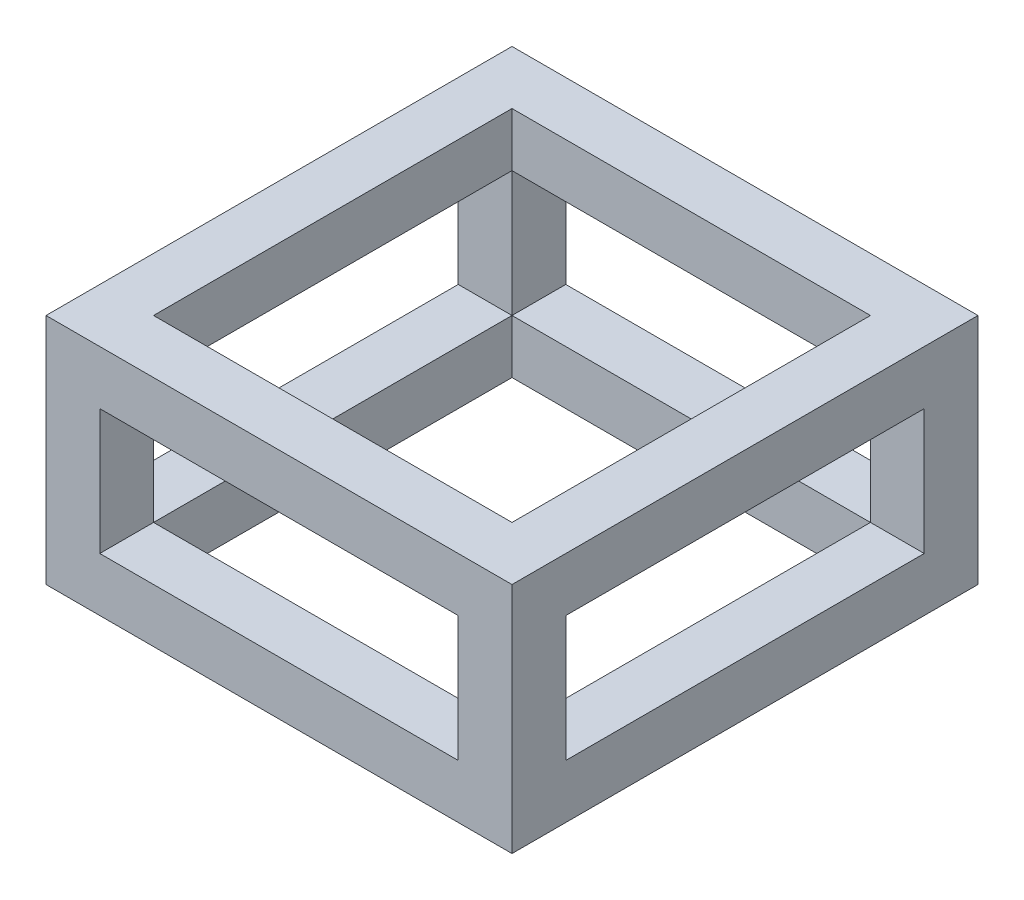
ISO-10303-21;
HEADER;
FILE_DESCRIPTION(('STEP AP214'),'2;1');
FILE_NAME('part.step','',(''),(''),'','','');
FILE_SCHEMA(('AUTOMOTIVE_DESIGN { 1 0 10303 214 1 1 1 1 }'));
ENDSEC;
DATA;
#1=APPLICATION_CONTEXT('core data for automotive mechanical design processes');
#2=APPLICATION_PROTOCOL_DEFINITION('international standard','automotive_design',2000,#1);
#3=PRODUCT_CONTEXT('',#1,'mechanical');
#4=PRODUCT('Part','Part','',(#3));
#5=PRODUCT_RELATED_PRODUCT_CATEGORY('part','',(#4));
#6=PRODUCT_DEFINITION_FORMATION('','',#4);
#7=PRODUCT_DEFINITION_CONTEXT('part definition',#1,'design');
#8=PRODUCT_DEFINITION('design','',#6,#7);
#9=PRODUCT_DEFINITION_SHAPE('','',#8);
#10=(LENGTH_UNIT() NAMED_UNIT(*) SI_UNIT(.MILLI.,.METRE.));
#11=(NAMED_UNIT(*) PLANE_ANGLE_UNIT() SI_UNIT($,.RADIAN.));
#12=(NAMED_UNIT(*) SI_UNIT($,.STERADIAN.) SOLID_ANGLE_UNIT());
#13=UNCERTAINTY_MEASURE_WITH_UNIT(LENGTH_MEASURE(1.E-05),#10,'distance_accuracy_value','');
#14=(GEOMETRIC_REPRESENTATION_CONTEXT(3) GLOBAL_UNCERTAINTY_ASSIGNED_CONTEXT((#13)) GLOBAL_UNIT_ASSIGNED_CONTEXT((#10,
#11,#12)) REPRESENTATION_CONTEXT('',''));
#15=CARTESIAN_POINT('',(0.,0.,0.));
#16=DIRECTION('',(0.,0.,1.));
#17=DIRECTION('',(1.,0.,0.));
#18=AXIS2_PLACEMENT_3D('',#15,#16,#17);
#19=CARTESIAN_POINT('',(0.,15.,0.));
#20=DIRECTION('',(0.,1.,0.));
#21=DIRECTION('',(0.,0.,1.));
#22=AXIS2_PLACEMENT_3D('',#19,#20,#21);
#23=PLANE('',#22);
#24=DIRECTION('',(1.,0.,0.));
#25=VECTOR('',#24,1.);
#26=CARTESIAN_POINT('',(-50.,15.,50.));
#27=LINE('',#26,#25);
#28=CARTESIAN_POINT('',(-50.,15.,50.));
#29=VERTEX_POINT('',#28);
#30=CARTESIAN_POINT('',(50.,15.,50.));
#31=VERTEX_POINT('',#30);
#32=EDGE_CURVE('E333',#29,#31,#27,.T.);
#33=ORIENTED_EDGE('',*,*,#32,.F.);
#34=DIRECTION('',(0.,0.,-1.));
#35=VECTOR('',#34,1.);
#36=CARTESIAN_POINT('',(-50.,15.,50.));
#37=LINE('',#36,#35);
#38=CARTESIAN_POINT('',(-50.,15.,65.));
#39=VERTEX_POINT('',#38);
#40=EDGE_CURVE('E231',#39,#29,#37,.T.);
#41=ORIENTED_EDGE('',*,*,#40,.F.);
#42=DIRECTION('',(1.,0.,0.));
#43=VECTOR('',#42,1.);
#44=CARTESIAN_POINT('',(-65.,15.,65.));
#45=LINE('',#44,#43);
#46=CARTESIAN_POINT('',(50.,15.,65.));
#47=VERTEX_POINT('',#46);
#48=EDGE_CURVE('E363',#39,#47,#45,.T.);
#49=ORIENTED_EDGE('',*,*,#48,.T.);
#50=DIRECTION('',(0.,0.,1.));
#51=VECTOR('',#50,1.);
#52=CARTESIAN_POINT('',(50.,15.,65.));
#53=LINE('',#52,#51);
#54=EDGE_CURVE('E265',#31,#47,#53,.T.);
#55=ORIENTED_EDGE('',*,*,#54,.F.);
#56=EDGE_LOOP('',(#33,#41,#49,#55));
#57=FACE_BOUND('',#56,.T.);
#58=ADVANCED_FACE('F33',(#57),#23,.T.);
#59=DIRECTION('',(0.,0.,1.));
#60=VECTOR('',#59,1.);
#61=CARTESIAN_POINT('',(-65.,15.,-65.));
#62=LINE('',#61,#60);
#63=CARTESIAN_POINT('',(-65.,15.,-50.));
#64=VERTEX_POINT('',#63);
#65=CARTESIAN_POINT('',(-65.,15.,50.));
#66=VERTEX_POINT('',#65);
#67=EDGE_CURVE('E48',#64,#66,#62,.T.);
#68=ORIENTED_EDGE('',*,*,#67,.T.);
#69=DIRECTION('',(-1.,0.,0.));
#70=VECTOR('',#69,1.);
#71=CARTESIAN_POINT('',(-50.,15.,50.));
#72=LINE('',#71,#70);
#73=EDGE_CURVE('E246',#29,#66,#72,.T.);
#74=ORIENTED_EDGE('',*,*,#73,.F.);
#75=DIRECTION('',(0.,0.,1.));
#76=VECTOR('',#75,1.);
#77=CARTESIAN_POINT('',(-50.,15.,-50.));
#78=LINE('',#77,#76);
#79=CARTESIAN_POINT('',(-50.,15.,-50.));
#80=VERTEX_POINT('',#79);
#81=EDGE_CURVE('E330',#80,#29,#78,.T.);
#82=ORIENTED_EDGE('',*,*,#81,.F.);
#83=DIRECTION('',(1.,0.,0.));
#84=VECTOR('',#83,1.);
#85=CARTESIAN_POINT('',(-65.,15.,-50.));
#86=LINE('',#85,#84);
#87=EDGE_CURVE('E301',#64,#80,#86,.T.);
#88=ORIENTED_EDGE('',*,*,#87,.F.);
#89=EDGE_LOOP('',(#68,#74,#82,#88));
#90=FACE_BOUND('',#89,.T.);
#91=ADVANCED_FACE('F437',(#90),#23,.T.);
#92=DIRECTION('',(0.,0.,-1.));
#93=VECTOR('',#92,1.);
#94=CARTESIAN_POINT('',(50.,15.,-50.));
#95=LINE('',#94,#93);
#96=CARTESIAN_POINT('',(50.,15.,-50.));
#97=VERTEX_POINT('',#96);
#98=EDGE_CURVE('E323',#31,#97,#95,.T.);
#99=ORIENTED_EDGE('',*,*,#98,.F.);
#100=DIRECTION('',(-1.,0.,0.));
#101=VECTOR('',#100,1.);
#102=CARTESIAN_POINT('',(65.,15.,50.));
#103=LINE('',#102,#101);
#104=CARTESIAN_POINT('',(65.,15.,50.));
#105=VERTEX_POINT('',#104);
#106=EDGE_CURVE('E56',#105,#31,#103,.T.);
#107=ORIENTED_EDGE('',*,*,#106,.F.);
#108=DIRECTION('',(0.,0.,-1.));
#109=VECTOR('',#108,1.);
#110=CARTESIAN_POINT('',(65.,15.,-65.));
#111=LINE('',#110,#109);
#112=CARTESIAN_POINT('',(65.,15.,-50.));
#113=VERTEX_POINT('',#112);
#114=EDGE_CURVE('E357',#105,#113,#111,.T.);
#115=ORIENTED_EDGE('',*,*,#114,.T.);
#116=DIRECTION('',(1.,0.,0.));
#117=VECTOR('',#116,1.);
#118=CARTESIAN_POINT('',(50.,15.,-50.));
#119=LINE('',#118,#117);
#120=EDGE_CURVE('E285',#97,#113,#119,.T.);
#121=ORIENTED_EDGE('',*,*,#120,.F.);
#122=EDGE_LOOP('',(#99,#107,#115,#121));
#123=FACE_BOUND('',#122,.T.);
#124=ADVANCED_FACE('F475',(#123),#23,.T.);
#125=DIRECTION('',(-1.,0.,0.));
#126=VECTOR('',#125,1.);
#127=CARTESIAN_POINT('',(-50.,15.,-50.));
#128=LINE('',#127,#126);
#129=EDGE_CURVE('E326',#97,#80,#128,.T.);
#130=ORIENTED_EDGE('',*,*,#129,.F.);
#131=DIRECTION('',(0.,0.,1.));
#132=VECTOR('',#131,1.);
#133=CARTESIAN_POINT('',(50.,15.,-50.));
#134=LINE('',#133,#132);
#135=CARTESIAN_POINT('',(50.,15.,-65.));
#136=VERTEX_POINT('',#135);
#137=EDGE_CURVE('E280',#136,#97,#134,.T.);
#138=ORIENTED_EDGE('',*,*,#137,.F.);
#139=DIRECTION('',(-1.,0.,0.));
#140=VECTOR('',#139,1.);
#141=CARTESIAN_POINT('',(-65.,15.,-65.));
#142=LINE('',#141,#140);
#143=CARTESIAN_POINT('',(-50.,15.,-65.));
#144=VERTEX_POINT('',#143);
#145=EDGE_CURVE('E359',#136,#144,#142,.T.);
#146=ORIENTED_EDGE('',*,*,#145,.T.);
#147=DIRECTION('',(0.,0.,-1.));
#148=VECTOR('',#147,1.);
#149=CARTESIAN_POINT('',(-50.,15.,-65.));
#150=LINE('',#149,#148);
#151=EDGE_CURVE('E306',#80,#144,#150,.T.);
#152=ORIENTED_EDGE('',*,*,#151,.F.);
#153=EDGE_LOOP('',(#130,#138,#146,#152));
#154=FACE_BOUND('',#153,.T.);
#155=ADVANCED_FACE('F449',(#154),#23,.T.);
#156=CARTESIAN_POINT('',(0.,0.,0.));
#157=DIRECTION('',(0.,1.,0.));
#158=DIRECTION('',(0.,0.,1.));
#159=AXIS2_PLACEMENT_3D('',#156,#157,#158);
#160=PLANE('',#159);
#161=DIRECTION('',(0.,0.,-1.));
#162=VECTOR('',#161,1.);
#163=CARTESIAN_POINT('',(65.,0.,-65.));
#164=LINE('',#163,#162);
#165=CARTESIAN_POINT('',(65.,0.,65.));
#166=VERTEX_POINT('',#165);
#167=CARTESIAN_POINT('',(65.,0.,-65.));
#168=VERTEX_POINT('',#167);
#169=EDGE_CURVE('E356',#166,#168,#164,.T.);
#170=ORIENTED_EDGE('',*,*,#169,.F.);
#171=DIRECTION('',(1.,0.,0.));
#172=VECTOR('',#171,1.);
#173=CARTESIAN_POINT('',(-65.,0.,65.));
#174=LINE('',#173,#172);
#175=CARTESIAN_POINT('',(-65.,0.,65.));
#176=VERTEX_POINT('',#175);
#177=EDGE_CURVE('E360',#176,#166,#174,.T.);
#178=ORIENTED_EDGE('',*,*,#177,.F.);
#179=DIRECTION('',(0.,0.,1.));
#180=VECTOR('',#179,1.);
#181=CARTESIAN_POINT('',(-65.,0.,-65.));
#182=LINE('',#181,#180);
#183=CARTESIAN_POINT('',(-65.,0.,-65.));
#184=VERTEX_POINT('',#183);
#185=EDGE_CURVE('E370',#184,#176,#182,.T.);
#186=ORIENTED_EDGE('',*,*,#185,.F.);
#187=DIRECTION('',(-1.,0.,0.));
#188=VECTOR('',#187,1.);
#189=CARTESIAN_POINT('',(-65.,0.,-65.));
#190=LINE('',#189,#188);
#191=EDGE_CURVE('E368',#168,#184,#190,.T.);
#192=ORIENTED_EDGE('',*,*,#191,.F.);
#193=EDGE_LOOP('',(#170,#178,#186,#192));
#194=FACE_BOUND('',#193,.T.);
#195=DIRECTION('',(0.,0.,-1.));
#196=VECTOR('',#195,1.);
#197=CARTESIAN_POINT('',(50.,0.,-50.));
#198=LINE('',#197,#196);
#199=CARTESIAN_POINT('',(50.,0.,50.));
#200=VERTEX_POINT('',#199);
#201=CARTESIAN_POINT('',(50.,0.,-50.));
#202=VERTEX_POINT('',#201);
#203=EDGE_CURVE('E322',#200,#202,#198,.T.);
#204=ORIENTED_EDGE('',*,*,#203,.T.);
#205=DIRECTION('',(-1.,0.,0.));
#206=VECTOR('',#205,1.);
#207=CARTESIAN_POINT('',(-50.,0.,-50.));
#208=LINE('',#207,#206);
#209=CARTESIAN_POINT('',(-50.,0.,-50.));
#210=VERTEX_POINT('',#209);
#211=EDGE_CURVE('E339',#202,#210,#208,.T.);
#212=ORIENTED_EDGE('',*,*,#211,.T.);
#213=DIRECTION('',(0.,0.,1.));
#214=VECTOR('',#213,1.);
#215=CARTESIAN_POINT('',(-50.,0.,-50.));
#216=LINE('',#215,#214);
#217=CARTESIAN_POINT('',(-50.,0.,50.));
#218=VERTEX_POINT('',#217);
#219=EDGE_CURVE('E342',#210,#218,#216,.T.);
#220=ORIENTED_EDGE('',*,*,#219,.T.);
#221=DIRECTION('',(1.,0.,0.));
#222=VECTOR('',#221,1.);
#223=CARTESIAN_POINT('',(-50.,0.,50.));
#224=LINE('',#223,#222);
#225=EDGE_CURVE('E327',#218,#200,#224,.T.);
#226=ORIENTED_EDGE('',*,*,#225,.T.);
#227=EDGE_LOOP('',(#204,#212,#220,#226));
#228=FACE_BOUND('',#227,.T.);
#229=ADVANCED_FACE('F387',(#194,#228),#160,.F.);
#230=CARTESIAN_POINT('',(65.,15.,-65.));
#231=DIRECTION('',(-1.,0.,0.));
#232=DIRECTION('',(0.,0.,1.));
#233=AXIS2_PLACEMENT_3D('',#230,#231,#232);
#234=PLANE('',#233);
#235=DIRECTION('',(0.,-1.,0.));
#236=VECTOR('',#235,1.);
#237=CARTESIAN_POINT('',(65.,15.,-65.));
#238=LINE('',#237,#236);
#239=CARTESIAN_POINT('',(65.,65.,-65.));
#240=VERTEX_POINT('',#239);
#241=EDGE_CURVE('E11',#240,#168,#238,.T.);
#242=ORIENTED_EDGE('',*,*,#241,.F.);
#243=DIRECTION('',(0.,0.,-1.));
#244=VECTOR('',#243,1.);
#245=CARTESIAN_POINT('',(65.,65.,-65.));
#246=LINE('',#245,#244);
#247=CARTESIAN_POINT('',(65.,65.,65.));
#248=VERTEX_POINT('',#247);
#249=EDGE_CURVE('E225',#248,#240,#246,.T.);
#250=ORIENTED_EDGE('',*,*,#249,.F.);
#251=DIRECTION('',(0.,-1.,0.));
#252=VECTOR('',#251,1.);
#253=CARTESIAN_POINT('',(65.,15.,65.));
#254=LINE('',#253,#252);
#255=EDGE_CURVE('E365',#248,#166,#254,.T.);
#256=ORIENTED_EDGE('',*,*,#255,.T.);
#257=ORIENTED_EDGE('',*,*,#169,.T.);
#258=EDGE_LOOP('',(#242,#250,#256,#257));
#259=FACE_BOUND('',#258,.T.);
#260=DIRECTION('',(0.,0.,-1.));
#261=VECTOR('',#260,1.);
#262=CARTESIAN_POINT('',(65.,50.,-65.));
#263=LINE('',#262,#261);
#264=CARTESIAN_POINT('',(65.,50.,50.));
#265=VERTEX_POINT('',#264);
#266=CARTESIAN_POINT('',(65.,50.,-50.));
#267=VERTEX_POINT('',#266);
#268=EDGE_CURVE('E237',#265,#267,#263,.T.);
#269=ORIENTED_EDGE('',*,*,#268,.T.);
#270=DIRECTION('',(0.,-1.,0.));
#271=VECTOR('',#270,1.);
#272=CARTESIAN_POINT('',(65.,50.,-50.));
#273=LINE('',#272,#271);
#274=EDGE_CURVE('E295',#267,#113,#273,.T.);
#275=ORIENTED_EDGE('',*,*,#274,.T.);
#276=ORIENTED_EDGE('',*,*,#114,.F.);
#277=DIRECTION('',(0.,-1.,0.));
#278=VECTOR('',#277,1.);
#279=CARTESIAN_POINT('',(65.,50.,50.));
#280=LINE('',#279,#278);
#281=EDGE_CURVE('E277',#265,#105,#280,.T.);
#282=ORIENTED_EDGE('',*,*,#281,.F.);
#283=EDGE_LOOP('',(#269,#275,#276,#282));
#284=FACE_BOUND('',#283,.T.);
#285=ADVANCED_FACE('F35',(#259,#284),#234,.F.);
#286=CARTESIAN_POINT('',(-65.,15.,-65.));
#287=DIRECTION('',(0.,0.,1.));
#288=DIRECTION('',(1.,0.,0.));
#289=AXIS2_PLACEMENT_3D('',#286,#287,#288);
#290=PLANE('',#289);
#291=DIRECTION('',(0.,-1.,0.));
#292=VECTOR('',#291,1.);
#293=CARTESIAN_POINT('',(-65.,15.,-65.));
#294=LINE('',#293,#292);
#295=CARTESIAN_POINT('',(-65.,65.,-65.));
#296=VERTEX_POINT('',#295);
#297=EDGE_CURVE('E41',#296,#184,#294,.T.);
#298=ORIENTED_EDGE('',*,*,#297,.F.);
#299=DIRECTION('',(-1.,0.,0.));
#300=VECTOR('',#299,1.);
#301=CARTESIAN_POINT('',(-65.,65.,-65.));
#302=LINE('',#301,#300);
#303=EDGE_CURVE('E228',#240,#296,#302,.T.);
#304=ORIENTED_EDGE('',*,*,#303,.F.);
#305=ORIENTED_EDGE('',*,*,#241,.T.);
#306=ORIENTED_EDGE('',*,*,#191,.T.);
#307=EDGE_LOOP('',(#298,#304,#305,#306));
#308=FACE_BOUND('',#307,.T.);
#309=DIRECTION('',(-1.,0.,0.));
#310=VECTOR('',#309,1.);
#311=CARTESIAN_POINT('',(-65.,50.,-65.));
#312=LINE('',#311,#310);
#313=CARTESIAN_POINT('',(50.,50.,-65.));
#314=VERTEX_POINT('',#313);
#315=CARTESIAN_POINT('',(-50.,50.,-65.));
#316=VERTEX_POINT('',#315);
#317=EDGE_CURVE('E222',#314,#316,#312,.T.);
#318=ORIENTED_EDGE('',*,*,#317,.T.);
#319=DIRECTION('',(0.,-1.,0.));
#320=VECTOR('',#319,1.);
#321=CARTESIAN_POINT('',(-50.,50.,-65.));
#322=LINE('',#321,#320);
#323=EDGE_CURVE('E309',#316,#144,#322,.T.);
#324=ORIENTED_EDGE('',*,*,#323,.T.);
#325=ORIENTED_EDGE('',*,*,#145,.F.);
#326=DIRECTION('',(0.,-1.,0.));
#327=VECTOR('',#326,1.);
#328=CARTESIAN_POINT('',(50.,50.,-65.));
#329=LINE('',#328,#327);
#330=EDGE_CURVE('E288',#314,#136,#329,.T.);
#331=ORIENTED_EDGE('',*,*,#330,.F.);
#332=EDGE_LOOP('',(#318,#324,#325,#331));
#333=FACE_BOUND('',#332,.T.);
#334=ADVANCED_FACE('F397',(#308,#333),#290,.F.);
#335=CARTESIAN_POINT('',(-65.,15.,-65.));
#336=DIRECTION('',(1.,0.,0.));
#337=DIRECTION('',(0.,0.,-1.));
#338=AXIS2_PLACEMENT_3D('',#335,#336,#337);
#339=PLANE('',#338);
#340=DIRECTION('',(0.,-1.,0.));
#341=VECTOR('',#340,1.);
#342=CARTESIAN_POINT('',(-65.,50.,-50.));
#343=LINE('',#342,#341);
#344=CARTESIAN_POINT('',(-65.,50.,-50.));
#345=VERTEX_POINT('',#344);
#346=EDGE_CURVE('E319',#345,#64,#343,.T.);
#347=ORIENTED_EDGE('',*,*,#346,.F.);
#348=DIRECTION('',(0.,0.,1.));
#349=VECTOR('',#348,1.);
#350=CARTESIAN_POINT('',(-65.,50.,-65.));
#351=LINE('',#350,#349);
#352=CARTESIAN_POINT('',(-65.,50.,50.));
#353=VERTEX_POINT('',#352);
#354=EDGE_CURVE('E193',#345,#353,#351,.T.);
#355=ORIENTED_EDGE('',*,*,#354,.T.);
#356=DIRECTION('',(0.,-1.,0.));
#357=VECTOR('',#356,1.);
#358=CARTESIAN_POINT('',(-65.,50.,50.));
#359=LINE('',#358,#357);
#360=EDGE_CURVE('E255',#353,#66,#359,.T.);
#361=ORIENTED_EDGE('',*,*,#360,.T.);
#362=ORIENTED_EDGE('',*,*,#67,.F.);
#363=EDGE_LOOP('',(#347,#355,#361,#362));
#364=FACE_BOUND('',#363,.T.);
#365=ORIENTED_EDGE('',*,*,#185,.T.);
#366=DIRECTION('',(0.,-1.,0.));
#367=VECTOR('',#366,1.);
#368=CARTESIAN_POINT('',(-65.,15.,65.));
#369=LINE('',#368,#367);
#370=CARTESIAN_POINT('',(-65.,65.,65.));
#371=VERTEX_POINT('',#370);
#372=EDGE_CURVE('E375',#371,#176,#369,.T.);
#373=ORIENTED_EDGE('',*,*,#372,.F.);
#374=DIRECTION('',(0.,0.,1.));
#375=VECTOR('',#374,1.);
#376=CARTESIAN_POINT('',(-65.,65.,-65.));
#377=LINE('',#376,#375);
#378=EDGE_CURVE('E218',#296,#371,#377,.T.);
#379=ORIENTED_EDGE('',*,*,#378,.F.);
#380=ORIENTED_EDGE('',*,*,#297,.T.);
#381=EDGE_LOOP('',(#365,#373,#379,#380));
#382=FACE_BOUND('',#381,.T.);
#383=ADVANCED_FACE('F381',(#364,#382),#339,.F.);
#384=CARTESIAN_POINT('',(-65.,15.,65.));
#385=DIRECTION('',(0.,0.,-1.));
#386=DIRECTION('',(-1.,0.,0.));
#387=AXIS2_PLACEMENT_3D('',#384,#385,#386);
#388=PLANE('',#387);
#389=ORIENTED_EDGE('',*,*,#255,.F.);
#390=DIRECTION('',(1.,0.,0.));
#391=VECTOR('',#390,1.);
#392=CARTESIAN_POINT('',(-65.,65.,65.));
#393=LINE('',#392,#391);
#394=EDGE_CURVE('E221',#371,#248,#393,.T.);
#395=ORIENTED_EDGE('',*,*,#394,.F.);
#396=ORIENTED_EDGE('',*,*,#372,.T.);
#397=ORIENTED_EDGE('',*,*,#177,.T.);
#398=EDGE_LOOP('',(#389,#395,#396,#397));
#399=FACE_BOUND('',#398,.T.);
#400=DIRECTION('',(1.,0.,0.));
#401=VECTOR('',#400,1.);
#402=CARTESIAN_POINT('',(-65.,50.,65.));
#403=LINE('',#402,#401);
#404=CARTESIAN_POINT('',(-50.,50.,65.));
#405=VERTEX_POINT('',#404);
#406=CARTESIAN_POINT('',(50.,50.,65.));
#407=VERTEX_POINT('',#406);
#408=EDGE_CURVE('E234',#405,#407,#403,.T.);
#409=ORIENTED_EDGE('',*,*,#408,.T.);
#410=DIRECTION('',(0.,-1.,0.));
#411=VECTOR('',#410,1.);
#412=CARTESIAN_POINT('',(50.,50.,65.));
#413=LINE('',#412,#411);
#414=EDGE_CURVE('E268',#407,#47,#413,.T.);
#415=ORIENTED_EDGE('',*,*,#414,.T.);
#416=ORIENTED_EDGE('',*,*,#48,.F.);
#417=DIRECTION('',(0.,-1.,0.));
#418=VECTOR('',#417,1.);
#419=CARTESIAN_POINT('',(-50.,50.,65.));
#420=LINE('',#419,#418);
#421=EDGE_CURVE('E249',#405,#39,#420,.T.);
#422=ORIENTED_EDGE('',*,*,#421,.F.);
#423=EDGE_LOOP('',(#409,#415,#416,#422));
#424=FACE_BOUND('',#423,.T.);
#425=ADVANCED_FACE('F390',(#399,#424),#388,.F.);
#426=CARTESIAN_POINT('',(50.,15.,-50.));
#427=DIRECTION('',(-1.,0.,0.));
#428=DIRECTION('',(0.,0.,1.));
#429=AXIS2_PLACEMENT_3D('',#426,#427,#428);
#430=PLANE('',#429);
#431=ORIENTED_EDGE('',*,*,#203,.F.);
#432=DIRECTION('',(0.,-1.,0.));
#433=VECTOR('',#432,1.);
#434=CARTESIAN_POINT('',(50.,15.,50.));
#435=LINE('',#434,#433);
#436=EDGE_CURVE('E336',#31,#200,#435,.T.);
#437=ORIENTED_EDGE('',*,*,#436,.F.);
#438=ORIENTED_EDGE('',*,*,#98,.T.);
#439=DIRECTION('',(0.,-1.,0.));
#440=VECTOR('',#439,1.);
#441=CARTESIAN_POINT('',(50.,15.,-50.));
#442=LINE('',#441,#440);
#443=EDGE_CURVE('E353',#97,#202,#442,.T.);
#444=ORIENTED_EDGE('',*,*,#443,.T.);
#445=EDGE_LOOP('',(#431,#437,#438,#444));
#446=FACE_BOUND('',#445,.T.);
#447=ADVANCED_FACE('F486',(#446),#430,.T.);
#448=CARTESIAN_POINT('',(-50.,15.,-50.));
#449=DIRECTION('',(0.,0.,1.));
#450=DIRECTION('',(1.,0.,0.));
#451=AXIS2_PLACEMENT_3D('',#448,#449,#450);
#452=PLANE('',#451);
#453=ORIENTED_EDGE('',*,*,#211,.F.);
#454=ORIENTED_EDGE('',*,*,#443,.F.);
#455=ORIENTED_EDGE('',*,*,#129,.T.);
#456=DIRECTION('',(0.,-1.,0.));
#457=VECTOR('',#456,1.);
#458=CARTESIAN_POINT('',(-50.,15.,-50.));
#459=LINE('',#458,#457);
#460=EDGE_CURVE('E351',#80,#210,#459,.T.);
#461=ORIENTED_EDGE('',*,*,#460,.T.);
#462=EDGE_LOOP('',(#453,#454,#455,#461));
#463=FACE_BOUND('',#462,.T.);
#464=ADVANCED_FACE('F446',(#463),#452,.T.);
#465=CARTESIAN_POINT('',(-50.,15.,-50.));
#466=DIRECTION('',(1.,0.,0.));
#467=DIRECTION('',(0.,0.,-1.));
#468=AXIS2_PLACEMENT_3D('',#465,#466,#467);
#469=PLANE('',#468);
#470=ORIENTED_EDGE('',*,*,#219,.F.);
#471=ORIENTED_EDGE('',*,*,#460,.F.);
#472=ORIENTED_EDGE('',*,*,#81,.T.);
#473=DIRECTION('',(0.,-1.,0.));
#474=VECTOR('',#473,1.);
#475=CARTESIAN_POINT('',(-50.,15.,50.));
#476=LINE('',#475,#474);
#477=EDGE_CURVE('E349',#29,#218,#476,.T.);
#478=ORIENTED_EDGE('',*,*,#477,.T.);
#479=EDGE_LOOP('',(#470,#471,#472,#478));
#480=FACE_BOUND('',#479,.T.);
#481=ADVANCED_FACE('F441',(#480),#469,.T.);
#482=CARTESIAN_POINT('',(-50.,15.,50.));
#483=DIRECTION('',(0.,0.,-1.));
#484=DIRECTION('',(-1.,0.,0.));
#485=AXIS2_PLACEMENT_3D('',#482,#483,#484);
#486=PLANE('',#485);
#487=ORIENTED_EDGE('',*,*,#225,.F.);
#488=ORIENTED_EDGE('',*,*,#477,.F.);
#489=ORIENTED_EDGE('',*,*,#32,.T.);
#490=ORIENTED_EDGE('',*,*,#436,.T.);
#491=EDGE_LOOP('',(#487,#488,#489,#490));
#492=FACE_BOUND('',#491,.T.);
#493=ADVANCED_FACE('F488',(#492),#486,.T.);
#494=CARTESIAN_POINT('',(-65.,50.,-50.));
#495=DIRECTION('',(0.,0.,-1.));
#496=DIRECTION('',(-1.,0.,0.));
#497=AXIS2_PLACEMENT_3D('',#494,#495,#496);
#498=PLANE('',#497);
#499=ORIENTED_EDGE('',*,*,#87,.T.);
#500=DIRECTION('',(0.,-1.,0.));
#501=VECTOR('',#500,1.);
#502=CARTESIAN_POINT('',(-50.,50.,-50.));
#503=LINE('',#502,#501);
#504=CARTESIAN_POINT('',(-50.,50.,-50.));
#505=VERTEX_POINT('',#504);
#506=EDGE_CURVE('E316',#505,#80,#503,.T.);
#507=ORIENTED_EDGE('',*,*,#506,.F.);
#508=DIRECTION('',(1.,0.,0.));
#509=VECTOR('',#508,1.);
#510=CARTESIAN_POINT('',(-65.,50.,-50.));
#511=LINE('',#510,#509);
#512=EDGE_CURVE('E302',#345,#505,#511,.T.);
#513=ORIENTED_EDGE('',*,*,#512,.F.);
#514=ORIENTED_EDGE('',*,*,#346,.T.);
#515=EDGE_LOOP('',(#499,#507,#513,#514));
#516=FACE_BOUND('',#515,.T.);
#517=ADVANCED_FACE('F436',(#516),#498,.F.);
#518=CARTESIAN_POINT('',(-50.,50.,-65.));
#519=DIRECTION('',(-1.,0.,0.));
#520=DIRECTION('',(0.,0.,1.));
#521=AXIS2_PLACEMENT_3D('',#518,#519,#520);
#522=PLANE('',#521);
#523=ORIENTED_EDGE('',*,*,#151,.T.);
#524=ORIENTED_EDGE('',*,*,#323,.F.);
#525=DIRECTION('',(0.,0.,-1.));
#526=VECTOR('',#525,1.);
#527=CARTESIAN_POINT('',(-50.,50.,-65.));
#528=LINE('',#527,#526);
#529=EDGE_CURVE('E305',#505,#316,#528,.T.);
#530=ORIENTED_EDGE('',*,*,#529,.F.);
#531=ORIENTED_EDGE('',*,*,#506,.T.);
#532=EDGE_LOOP('',(#523,#524,#530,#531));
#533=FACE_BOUND('',#532,.T.);
#534=ADVANCED_FACE('F407',(#533),#522,.F.);
#535=CARTESIAN_POINT('',(50.,50.,-50.));
#536=DIRECTION('',(1.,0.,0.));
#537=DIRECTION('',(0.,0.,-1.));
#538=AXIS2_PLACEMENT_3D('',#535,#536,#537);
#539=PLANE('',#538);
#540=ORIENTED_EDGE('',*,*,#137,.T.);
#541=DIRECTION('',(0.,-1.,0.));
#542=VECTOR('',#541,1.);
#543=CARTESIAN_POINT('',(50.,50.,-50.));
#544=LINE('',#543,#542);
#545=CARTESIAN_POINT('',(50.,50.,-50.));
#546=VERTEX_POINT('',#545);
#547=EDGE_CURVE('E298',#546,#97,#544,.T.);
#548=ORIENTED_EDGE('',*,*,#547,.F.);
#549=DIRECTION('',(0.,0.,1.));
#550=VECTOR('',#549,1.);
#551=CARTESIAN_POINT('',(50.,50.,-50.));
#552=LINE('',#551,#550);
#553=EDGE_CURVE('E281',#314,#546,#552,.T.);
#554=ORIENTED_EDGE('',*,*,#553,.F.);
#555=ORIENTED_EDGE('',*,*,#330,.T.);
#556=EDGE_LOOP('',(#540,#548,#554,#555));
#557=FACE_BOUND('',#556,.T.);
#558=ADVANCED_FACE('F452',(#557),#539,.F.);
#559=CARTESIAN_POINT('',(50.,50.,-50.));
#560=DIRECTION('',(0.,0.,-1.));
#561=DIRECTION('',(-1.,0.,0.));
#562=AXIS2_PLACEMENT_3D('',#559,#560,#561);
#563=PLANE('',#562);
#564=ORIENTED_EDGE('',*,*,#120,.T.);
#565=ORIENTED_EDGE('',*,*,#274,.F.);
#566=DIRECTION('',(1.,0.,0.));
#567=VECTOR('',#566,1.);
#568=CARTESIAN_POINT('',(50.,50.,-50.));
#569=LINE('',#568,#567);
#570=EDGE_CURVE('E284',#546,#267,#569,.T.);
#571=ORIENTED_EDGE('',*,*,#570,.F.);
#572=ORIENTED_EDGE('',*,*,#547,.T.);
#573=EDGE_LOOP('',(#564,#565,#571,#572));
#574=FACE_BOUND('',#573,.T.);
#575=ADVANCED_FACE('F454',(#574),#563,.F.);
#576=CARTESIAN_POINT('',(65.,50.,50.));
#577=DIRECTION('',(0.,0.,1.));
#578=DIRECTION('',(1.,0.,0.));
#579=AXIS2_PLACEMENT_3D('',#576,#577,#578);
#580=PLANE('',#579);
#581=ORIENTED_EDGE('',*,*,#106,.T.);
#582=DIRECTION('',(0.,-1.,0.));
#583=VECTOR('',#582,1.);
#584=CARTESIAN_POINT('',(50.,50.,50.));
#585=LINE('',#584,#583);
#586=CARTESIAN_POINT('',(50.,50.,50.));
#587=VERTEX_POINT('',#586);
#588=EDGE_CURVE('E274',#587,#31,#585,.T.);
#589=ORIENTED_EDGE('',*,*,#588,.F.);
#590=DIRECTION('',(-1.,0.,0.));
#591=VECTOR('',#590,1.);
#592=CARTESIAN_POINT('',(65.,50.,50.));
#593=LINE('',#592,#591);
#594=EDGE_CURVE('E261',#265,#587,#593,.T.);
#595=ORIENTED_EDGE('',*,*,#594,.F.);
#596=ORIENTED_EDGE('',*,*,#281,.T.);
#597=EDGE_LOOP('',(#581,#589,#595,#596));
#598=FACE_BOUND('',#597,.T.);
#599=ADVANCED_FACE('F459',(#598),#580,.F.);
#600=CARTESIAN_POINT('',(50.,50.,65.));
#601=DIRECTION('',(1.,0.,0.));
#602=DIRECTION('',(0.,0.,-1.));
#603=AXIS2_PLACEMENT_3D('',#600,#601,#602);
#604=PLANE('',#603);
#605=ORIENTED_EDGE('',*,*,#54,.T.);
#606=ORIENTED_EDGE('',*,*,#414,.F.);
#607=DIRECTION('',(0.,0.,1.));
#608=VECTOR('',#607,1.);
#609=CARTESIAN_POINT('',(50.,50.,65.));
#610=LINE('',#609,#608);
#611=EDGE_CURVE('E264',#587,#407,#610,.T.);
#612=ORIENTED_EDGE('',*,*,#611,.F.);
#613=ORIENTED_EDGE('',*,*,#588,.T.);
#614=EDGE_LOOP('',(#605,#606,#612,#613));
#615=FACE_BOUND('',#614,.T.);
#616=ADVANCED_FACE('F461',(#615),#604,.F.);
#617=CARTESIAN_POINT('',(-50.,50.,50.));
#618=DIRECTION('',(-1.,0.,0.));
#619=DIRECTION('',(0.,0.,1.));
#620=AXIS2_PLACEMENT_3D('',#617,#618,#619);
#621=PLANE('',#620);
#622=ORIENTED_EDGE('',*,*,#40,.T.);
#623=DIRECTION('',(0.,-1.,0.));
#624=VECTOR('',#623,1.);
#625=CARTESIAN_POINT('',(-50.,50.,50.));
#626=LINE('',#625,#624);
#627=CARTESIAN_POINT('',(-50.,50.,50.));
#628=VERTEX_POINT('',#627);
#629=EDGE_CURVE('E258',#628,#29,#626,.T.);
#630=ORIENTED_EDGE('',*,*,#629,.F.);
#631=DIRECTION('',(0.,0.,-1.));
#632=VECTOR('',#631,1.);
#633=CARTESIAN_POINT('',(-50.,50.,50.));
#634=LINE('',#633,#632);
#635=EDGE_CURVE('E242',#405,#628,#634,.T.);
#636=ORIENTED_EDGE('',*,*,#635,.F.);
#637=ORIENTED_EDGE('',*,*,#421,.T.);
#638=EDGE_LOOP('',(#622,#630,#636,#637));
#639=FACE_BOUND('',#638,.T.);
#640=ADVANCED_FACE('F426',(#639),#621,.F.);
#641=CARTESIAN_POINT('',(-50.,50.,50.));
#642=DIRECTION('',(0.,0.,1.));
#643=DIRECTION('',(1.,0.,0.));
#644=AXIS2_PLACEMENT_3D('',#641,#642,#643);
#645=PLANE('',#644);
#646=ORIENTED_EDGE('',*,*,#73,.T.);
#647=ORIENTED_EDGE('',*,*,#360,.F.);
#648=DIRECTION('',(-1.,0.,0.));
#649=VECTOR('',#648,1.);
#650=CARTESIAN_POINT('',(-50.,50.,50.));
#651=LINE('',#650,#649);
#652=EDGE_CURVE('E245',#628,#353,#651,.T.);
#653=ORIENTED_EDGE('',*,*,#652,.F.);
#654=ORIENTED_EDGE('',*,*,#629,.T.);
#655=EDGE_LOOP('',(#646,#647,#653,#654));
#656=FACE_BOUND('',#655,.T.);
#657=ADVANCED_FACE('F434',(#656),#645,.F.);
#658=CARTESIAN_POINT('',(0.,50.,0.));
#659=DIRECTION('',(0.,1.,0.));
#660=DIRECTION('',(0.,0.,1.));
#661=AXIS2_PLACEMENT_3D('',#658,#659,#660);
#662=PLANE('',#661);
#663=ORIENTED_EDGE('',*,*,#354,.F.);
#664=ORIENTED_EDGE('',*,*,#512,.T.);
#665=DIRECTION('',(0.,0.,1.));
#666=VECTOR('',#665,1.);
#667=CARTESIAN_POINT('',(-50.,50.,-50.));
#668=LINE('',#667,#666);
#669=EDGE_CURVE('E205',#505,#628,#668,.T.);
#670=ORIENTED_EDGE('',*,*,#669,.T.);
#671=ORIENTED_EDGE('',*,*,#652,.T.);
#672=EDGE_LOOP('',(#663,#664,#670,#671));
#673=FACE_BOUND('',#672,.T.);
#674=ADVANCED_FACE('F410',(#673),#662,.F.);
#675=DIRECTION('',(-1.,0.,0.));
#676=VECTOR('',#675,1.);
#677=CARTESIAN_POINT('',(-50.,50.,-50.));
#678=LINE('',#677,#676);
#679=EDGE_CURVE('E184',#546,#505,#678,.T.);
#680=ORIENTED_EDGE('',*,*,#679,.T.);
#681=ORIENTED_EDGE('',*,*,#529,.T.);
#682=ORIENTED_EDGE('',*,*,#317,.F.);
#683=ORIENTED_EDGE('',*,*,#553,.T.);
#684=EDGE_LOOP('',(#680,#681,#682,#683));
#685=FACE_BOUND('',#684,.T.);
#686=ADVANCED_FACE('F403',(#685),#662,.F.);
#687=DIRECTION('',(0.,0.,-1.));
#688=VECTOR('',#687,1.);
#689=CARTESIAN_POINT('',(50.,50.,-50.));
#690=LINE('',#689,#688);
#691=EDGE_CURVE('E208',#587,#546,#690,.T.);
#692=ORIENTED_EDGE('',*,*,#691,.T.);
#693=ORIENTED_EDGE('',*,*,#570,.T.);
#694=ORIENTED_EDGE('',*,*,#268,.F.);
#695=ORIENTED_EDGE('',*,*,#594,.T.);
#696=EDGE_LOOP('',(#692,#693,#694,#695));
#697=FACE_BOUND('',#696,.T.);
#698=ADVANCED_FACE('F456',(#697),#662,.F.);
#699=DIRECTION('',(1.,0.,0.));
#700=VECTOR('',#699,1.);
#701=CARTESIAN_POINT('',(-50.,50.,50.));
#702=LINE('',#701,#700);
#703=EDGE_CURVE('E192',#628,#587,#702,.T.);
#704=ORIENTED_EDGE('',*,*,#703,.T.);
#705=ORIENTED_EDGE('',*,*,#611,.T.);
#706=ORIENTED_EDGE('',*,*,#408,.F.);
#707=ORIENTED_EDGE('',*,*,#635,.T.);
#708=EDGE_LOOP('',(#704,#705,#706,#707));
#709=FACE_BOUND('',#708,.T.);
#710=ADVANCED_FACE('F420',(#709),#662,.F.);
#711=CARTESIAN_POINT('',(0.,65.,0.));
#712=DIRECTION('',(0.,1.,0.));
#713=DIRECTION('',(0.,0.,1.));
#714=AXIS2_PLACEMENT_3D('',#711,#712,#713);
#715=PLANE('',#714);
#716=ORIENTED_EDGE('',*,*,#378,.T.);
#717=ORIENTED_EDGE('',*,*,#394,.T.);
#718=ORIENTED_EDGE('',*,*,#249,.T.);
#719=ORIENTED_EDGE('',*,*,#303,.T.);
#720=EDGE_LOOP('',(#716,#717,#718,#719));
#721=FACE_BOUND('',#720,.T.);
#722=DIRECTION('',(1.,0.,0.));
#723=VECTOR('',#722,1.);
#724=CARTESIAN_POINT('',(-50.,65.,50.));
#725=LINE('',#724,#723);
#726=CARTESIAN_POINT('',(-50.,65.,50.));
#727=VERTEX_POINT('',#726);
#728=CARTESIAN_POINT('',(50.,65.,50.));
#729=VERTEX_POINT('',#728);
#730=EDGE_CURVE('E183',#727,#729,#725,.T.);
#731=ORIENTED_EDGE('',*,*,#730,.F.);
#732=DIRECTION('',(0.,0.,1.));
#733=VECTOR('',#732,1.);
#734=CARTESIAN_POINT('',(-50.,65.,-50.));
#735=LINE('',#734,#733);
#736=CARTESIAN_POINT('',(-50.,65.,-50.));
#737=VERTEX_POINT('',#736);
#738=EDGE_CURVE('E172',#737,#727,#735,.T.);
#739=ORIENTED_EDGE('',*,*,#738,.F.);
#740=DIRECTION('',(-1.,0.,0.));
#741=VECTOR('',#740,1.);
#742=CARTESIAN_POINT('',(-50.,65.,-50.));
#743=LINE('',#742,#741);
#744=CARTESIAN_POINT('',(50.,65.,-50.));
#745=VERTEX_POINT('',#744);
#746=EDGE_CURVE('E201',#745,#737,#743,.T.);
#747=ORIENTED_EDGE('',*,*,#746,.F.);
#748=DIRECTION('',(0.,0.,-1.));
#749=VECTOR('',#748,1.);
#750=CARTESIAN_POINT('',(50.,65.,-50.));
#751=LINE('',#750,#749);
#752=EDGE_CURVE('E199',#729,#745,#751,.T.);
#753=ORIENTED_EDGE('',*,*,#752,.F.);
#754=EDGE_LOOP('',(#731,#739,#747,#753));
#755=FACE_BOUND('',#754,.T.);
#756=ADVANCED_FACE('F197',(#721,#755),#715,.T.);
#757=CARTESIAN_POINT('',(-50.,65.,-50.));
#758=DIRECTION('',(1.,0.,0.));
#759=DIRECTION('',(0.,0.,-1.));
#760=AXIS2_PLACEMENT_3D('',#757,#758,#759);
#761=PLANE('',#760);
#762=ORIENTED_EDGE('',*,*,#669,.F.);
#763=DIRECTION('',(0.,-1.,0.));
#764=VECTOR('',#763,1.);
#765=CARTESIAN_POINT('',(-50.,65.,-50.));
#766=LINE('',#765,#764);
#767=EDGE_CURVE('E179',#737,#505,#766,.T.);
#768=ORIENTED_EDGE('',*,*,#767,.F.);
#769=ORIENTED_EDGE('',*,*,#738,.T.);
#770=DIRECTION('',(0.,-1.,0.));
#771=VECTOR('',#770,1.);
#772=CARTESIAN_POINT('',(-50.,65.,50.));
#773=LINE('',#772,#771);
#774=EDGE_CURVE('E176',#727,#628,#773,.T.);
#775=ORIENTED_EDGE('',*,*,#774,.T.);
#776=EDGE_LOOP('',(#762,#768,#769,#775));
#777=FACE_BOUND('',#776,.T.);
#778=ADVANCED_FACE('F175',(#777),#761,.T.);
#779=CARTESIAN_POINT('',(-50.,65.,50.));
#780=DIRECTION('',(0.,0.,-1.));
#781=DIRECTION('',(-1.,0.,0.));
#782=AXIS2_PLACEMENT_3D('',#779,#780,#781);
#783=PLANE('',#782);
#784=ORIENTED_EDGE('',*,*,#703,.F.);
#785=ORIENTED_EDGE('',*,*,#774,.F.);
#786=ORIENTED_EDGE('',*,*,#730,.T.);
#787=DIRECTION('',(0.,-1.,0.));
#788=VECTOR('',#787,1.);
#789=CARTESIAN_POINT('',(50.,65.,50.));
#790=LINE('',#789,#788);
#791=EDGE_CURVE('E194',#729,#587,#790,.T.);
#792=ORIENTED_EDGE('',*,*,#791,.T.);
#793=EDGE_LOOP('',(#784,#785,#786,#792));
#794=FACE_BOUND('',#793,.T.);
#795=ADVANCED_FACE('F188',(#794),#783,.T.);
#796=CARTESIAN_POINT('',(50.,65.,-50.));
#797=DIRECTION('',(-1.,0.,0.));
#798=DIRECTION('',(0.,0.,1.));
#799=AXIS2_PLACEMENT_3D('',#796,#797,#798);
#800=PLANE('',#799);
#801=ORIENTED_EDGE('',*,*,#691,.F.);
#802=ORIENTED_EDGE('',*,*,#791,.F.);
#803=ORIENTED_EDGE('',*,*,#752,.T.);
#804=DIRECTION('',(0.,-1.,0.));
#805=VECTOR('',#804,1.);
#806=CARTESIAN_POINT('',(50.,65.,-50.));
#807=LINE('',#806,#805);
#808=EDGE_CURVE('E214',#745,#546,#807,.T.);
#809=ORIENTED_EDGE('',*,*,#808,.T.);
#810=EDGE_LOOP('',(#801,#802,#803,#809));
#811=FACE_BOUND('',#810,.T.);
#812=ADVANCED_FACE('F417',(#811),#800,.T.);
#813=CARTESIAN_POINT('',(-50.,65.,-50.));
#814=DIRECTION('',(0.,0.,1.));
#815=DIRECTION('',(1.,0.,0.));
#816=AXIS2_PLACEMENT_3D('',#813,#814,#815);
#817=PLANE('',#816);
#818=ORIENTED_EDGE('',*,*,#679,.F.);
#819=ORIENTED_EDGE('',*,*,#808,.F.);
#820=ORIENTED_EDGE('',*,*,#746,.T.);
#821=ORIENTED_EDGE('',*,*,#767,.T.);
#822=EDGE_LOOP('',(#818,#819,#820,#821));
#823=FACE_BOUND('',#822,.T.);
#824=ADVANCED_FACE('F414',(#823),#817,.T.);
#825=CLOSED_SHELL('',(#58,#91,#124,#155,#229,#285,#334,#383,#425,#447,#464,#481,#493,#517,#534,
#558,#575,#599,#616,#640,#657,#674,#686,#698,#710,#756,#778,#795,#812,#824));
#826=MANIFOLD_SOLID_BREP('B2',#825);
#827=ADVANCED_BREP_SHAPE_REPRESENTATION('',(#18,#826),#14);
#828=SHAPE_DEFINITION_REPRESENTATION(#9,#827);
ENDSEC;
END-ISO-10303-21;
